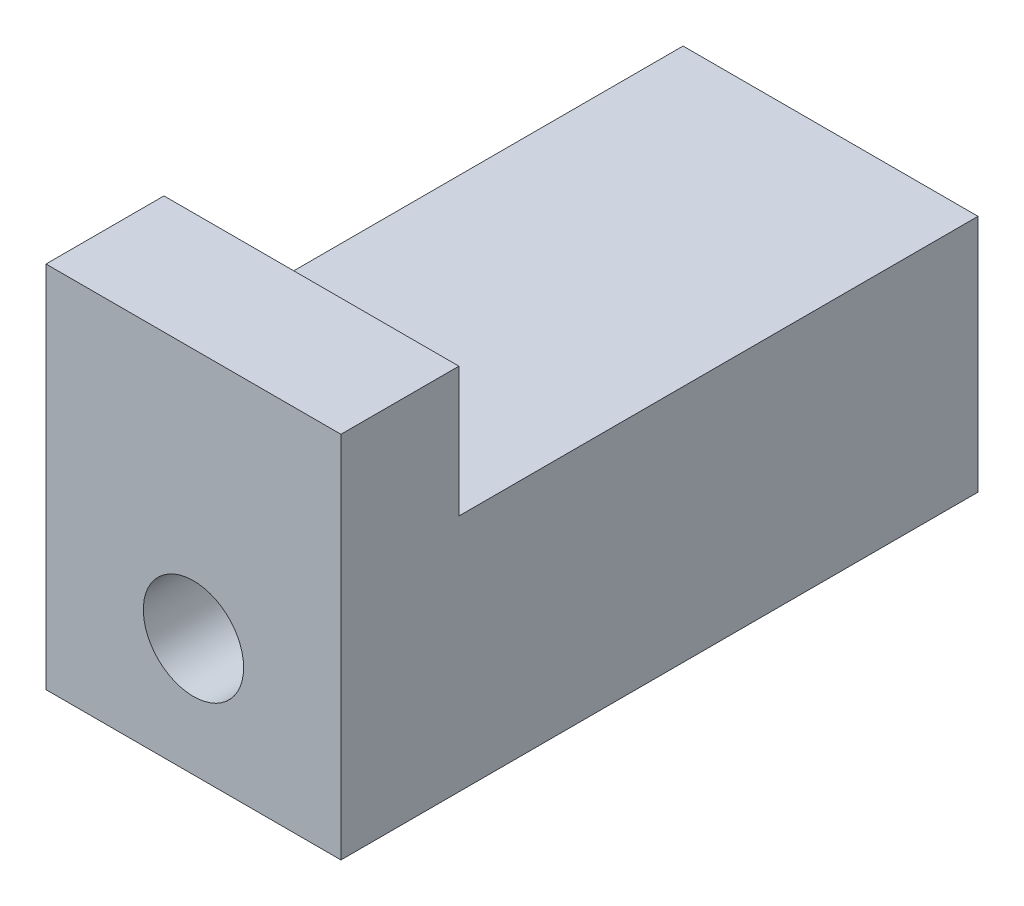
ISO-10303-21;
HEADER;
FILE_DESCRIPTION(('STEP AP214'),'2;1');
FILE_NAME('part.step','',(''),(''),'','','');
FILE_SCHEMA(('AUTOMOTIVE_DESIGN { 1 0 10303 214 1 1 1 1 }'));
ENDSEC;
DATA;
#1=APPLICATION_CONTEXT('core data for automotive mechanical design processes');
#2=APPLICATION_PROTOCOL_DEFINITION('international standard','automotive_design',2000,#1);
#3=PRODUCT_CONTEXT('',#1,'mechanical');
#4=PRODUCT('Part','Part','',(#3));
#5=PRODUCT_RELATED_PRODUCT_CATEGORY('part','',(#4));
#6=PRODUCT_DEFINITION_FORMATION('','',#4);
#7=PRODUCT_DEFINITION_CONTEXT('part definition',#1,'design');
#8=PRODUCT_DEFINITION('design','',#6,#7);
#9=PRODUCT_DEFINITION_SHAPE('','',#8);
#10=(LENGTH_UNIT() NAMED_UNIT(*) SI_UNIT(.MILLI.,.METRE.));
#11=(NAMED_UNIT(*) PLANE_ANGLE_UNIT() SI_UNIT($,.RADIAN.));
#12=(NAMED_UNIT(*) SI_UNIT($,.STERADIAN.) SOLID_ANGLE_UNIT());
#13=UNCERTAINTY_MEASURE_WITH_UNIT(LENGTH_MEASURE(1.E-05),#10,'distance_accuracy_value','');
#14=(GEOMETRIC_REPRESENTATION_CONTEXT(3) GLOBAL_UNCERTAINTY_ASSIGNED_CONTEXT((#13)) GLOBAL_UNIT_ASSIGNED_CONTEXT((#10,
#11,#12)) REPRESENTATION_CONTEXT('',''));
#15=CARTESIAN_POINT('',(0.,0.,0.));
#16=DIRECTION('',(0.,0.,1.));
#17=DIRECTION('',(1.,0.,0.));
#18=AXIS2_PLACEMENT_3D('',#15,#16,#17);
#19=CARTESIAN_POINT('',(128.,-48.5,221.8));
#20=DIRECTION('',(0.,0.,1.));
#21=DIRECTION('',(1.,0.,0.));
#22=AXIS2_PLACEMENT_3D('',#19,#20,#21);
#23=CYLINDRICAL_SURFACE('',#22,1.7);
#24=DIRECTION('',(0.,0.,1.));
#25=VECTOR('',#24,1.);
#26=CARTESIAN_POINT('',(129.7,-48.5,221.8));
#27=LINE('',#26,#25);
#28=CARTESIAN_POINT('',(129.7,-48.5,222.1));
#29=VERTEX_POINT('',#28);
#30=CARTESIAN_POINT('',(129.7,-48.5,243.7));
#31=VERTEX_POINT('',#30);
#32=EDGE_CURVE('E9',#29,#31,#27,.T.);
#33=ORIENTED_EDGE('',*,*,#32,.F.);
#34=CARTESIAN_POINT('',(128.,-48.5,222.1));
#35=DIRECTION('',(0.,0.,1.));
#36=DIRECTION('',(1.,0.,0.));
#37=AXIS2_PLACEMENT_3D('',#34,#35,#36);
#38=CIRCLE('',#37,1.7);
#39=EDGE_CURVE('E155',#29,#29,#38,.T.);
#40=ORIENTED_EDGE('',*,*,#39,.F.);
#41=ORIENTED_EDGE('',*,*,#32,.T.);
#42=CARTESIAN_POINT('',(128.,-48.5,243.7));
#43=DIRECTION('',(0.,0.,1.));
#44=DIRECTION('',(1.,0.,0.));
#45=AXIS2_PLACEMENT_3D('',#42,#43,#44);
#46=CIRCLE('',#45,1.7);
#47=EDGE_CURVE('E24',#31,#31,#46,.T.);
#48=ORIENTED_EDGE('',*,*,#47,.T.);
#49=EDGE_LOOP('',(#33,#40,#41,#48));
#50=FACE_BOUND('',#49,.T.);
#51=ADVANCED_FACE('F14',(#50),#23,.F.);
#52=CARTESIAN_POINT('',(133.,-52.5,222.1));
#53=DIRECTION('',(1.,0.,0.));
#54=DIRECTION('',(0.,1.,0.));
#55=AXIS2_PLACEMENT_3D('',#52,#53,#54);
#56=PLANE('',#55);
#57=DIRECTION('',(0.,0.,1.));
#58=VECTOR('',#57,1.);
#59=CARTESIAN_POINT('',(133.,-52.5,222.1));
#60=LINE('',#59,#58);
#61=CARTESIAN_POINT('',(133.,-52.5,222.1));
#62=VERTEX_POINT('',#61);
#63=CARTESIAN_POINT('',(133.,-52.5,243.7));
#64=VERTEX_POINT('',#63);
#65=EDGE_CURVE('E141',#62,#64,#60,.T.);
#66=ORIENTED_EDGE('',*,*,#65,.F.);
#67=DIRECTION('',(0.,1.,0.));
#68=VECTOR('',#67,1.);
#69=CARTESIAN_POINT('',(133.,-52.5,222.1));
#70=LINE('',#69,#68);
#71=CARTESIAN_POINT('',(133.,-44.4,222.1));
#72=VERTEX_POINT('',#71);
#73=EDGE_CURVE('E136',#62,#72,#70,.T.);
#74=ORIENTED_EDGE('',*,*,#73,.T.);
#75=DIRECTION('',(0.,0.,1.));
#76=VECTOR('',#75,1.);
#77=CARTESIAN_POINT('',(133.,-44.4,222.1));
#78=LINE('',#77,#76);
#79=CARTESIAN_POINT('',(133.,-44.4,239.7));
#80=VERTEX_POINT('',#79);
#81=EDGE_CURVE('E71',#72,#80,#78,.T.);
#82=ORIENTED_EDGE('',*,*,#81,.T.);
#83=DIRECTION('',(0.,1.,0.));
#84=VECTOR('',#83,1.);
#85=CARTESIAN_POINT('',(133.,-52.5,239.7));
#86=LINE('',#85,#84);
#87=CARTESIAN_POINT('',(133.,-40.,239.7));
#88=VERTEX_POINT('',#87);
#89=EDGE_CURVE('E111',#80,#88,#86,.T.);
#90=ORIENTED_EDGE('',*,*,#89,.T.);
#91=DIRECTION('',(0.,0.,1.));
#92=VECTOR('',#91,1.);
#93=CARTESIAN_POINT('',(133.,-40.,239.7));
#94=LINE('',#93,#92);
#95=CARTESIAN_POINT('',(133.,-40.,243.7));
#96=VERTEX_POINT('',#95);
#97=EDGE_CURVE('E107',#88,#96,#94,.T.);
#98=ORIENTED_EDGE('',*,*,#97,.T.);
#99=DIRECTION('',(0.,1.,0.));
#100=VECTOR('',#99,1.);
#101=CARTESIAN_POINT('',(133.,-52.5,243.7));
#102=LINE('',#101,#100);
#103=EDGE_CURVE('E18',#64,#96,#102,.T.);
#104=ORIENTED_EDGE('',*,*,#103,.F.);
#105=EDGE_LOOP('',(#66,#74,#82,#90,#98,#104));
#106=FACE_BOUND('',#105,.T.);
#107=ADVANCED_FACE('F185',(#106),#56,.T.);
#108=CARTESIAN_POINT('',(123.,-52.5,243.7));
#109=DIRECTION('',(0.,0.,1.));
#110=DIRECTION('',(1.,0.,0.));
#111=AXIS2_PLACEMENT_3D('',#108,#109,#110);
#112=PLANE('',#111);
#113=ORIENTED_EDGE('',*,*,#47,.F.);
#114=EDGE_LOOP('',(#113));
#115=FACE_BOUND('',#114,.T.);
#116=DIRECTION('',(0.,1.,0.));
#117=VECTOR('',#116,1.);
#118=CARTESIAN_POINT('',(123.,-52.5,243.7));
#119=LINE('',#118,#117);
#120=CARTESIAN_POINT('',(123.,-52.5,243.7));
#121=VERTEX_POINT('',#120);
#122=CARTESIAN_POINT('',(123.,-40.,243.7));
#123=VERTEX_POINT('',#122);
#124=EDGE_CURVE('E126',#121,#123,#119,.T.);
#125=ORIENTED_EDGE('',*,*,#124,.F.);
#126=DIRECTION('',(1.,0.,0.));
#127=VECTOR('',#126,1.);
#128=CARTESIAN_POINT('',(123.,-52.5,243.7));
#129=LINE('',#128,#127);
#130=EDGE_CURVE('E138',#121,#64,#129,.T.);
#131=ORIENTED_EDGE('',*,*,#130,.T.);
#132=ORIENTED_EDGE('',*,*,#103,.T.);
#133=DIRECTION('',(1.,0.,0.));
#134=VECTOR('',#133,1.);
#135=CARTESIAN_POINT('',(123.,-40.,243.7));
#136=LINE('',#135,#134);
#137=EDGE_CURVE('E150',#123,#96,#136,.T.);
#138=ORIENTED_EDGE('',*,*,#137,.F.);
#139=EDGE_LOOP('',(#125,#131,#132,#138));
#140=FACE_BOUND('',#139,.T.);
#141=ADVANCED_FACE('F196',(#115,#140),#112,.T.);
#142=CARTESIAN_POINT('',(123.,-40.,239.7));
#143=DIRECTION('',(0.,1.,0.));
#144=DIRECTION('',(1.,0.,0.));
#145=AXIS2_PLACEMENT_3D('',#142,#143,#144);
#146=PLANE('',#145);
#147=DIRECTION('',(1.,0.,0.));
#148=VECTOR('',#147,1.);
#149=CARTESIAN_POINT('',(123.,-40.,239.7));
#150=LINE('',#149,#148);
#151=CARTESIAN_POINT('',(123.,-40.,239.7));
#152=VERTEX_POINT('',#151);
#153=EDGE_CURVE('E100',#152,#88,#150,.T.);
#154=ORIENTED_EDGE('',*,*,#153,.F.);
#155=DIRECTION('',(0.,0.,1.));
#156=VECTOR('',#155,1.);
#157=CARTESIAN_POINT('',(123.,-40.,239.7));
#158=LINE('',#157,#156);
#159=EDGE_CURVE('E105',#152,#123,#158,.T.);
#160=ORIENTED_EDGE('',*,*,#159,.T.);
#161=ORIENTED_EDGE('',*,*,#137,.T.);
#162=ORIENTED_EDGE('',*,*,#97,.F.);
#163=EDGE_LOOP('',(#154,#160,#161,#162));
#164=FACE_BOUND('',#163,.T.);
#165=ADVANCED_FACE('F102',(#164),#146,.T.);
#166=CARTESIAN_POINT('',(123.,-52.5,239.7));
#167=DIRECTION('',(0.,0.,1.));
#168=DIRECTION('',(1.,0.,0.));
#169=AXIS2_PLACEMENT_3D('',#166,#167,#168);
#170=PLANE('',#169);
#171=ORIENTED_EDGE('',*,*,#153,.T.);
#172=ORIENTED_EDGE('',*,*,#89,.F.);
#173=DIRECTION('',(1.,0.,0.));
#174=VECTOR('',#173,1.);
#175=CARTESIAN_POINT('',(123.,-44.4,239.7));
#176=LINE('',#175,#174);
#177=CARTESIAN_POINT('',(123.,-44.4,239.7));
#178=VERTEX_POINT('',#177);
#179=EDGE_CURVE('E116',#178,#80,#176,.T.);
#180=ORIENTED_EDGE('',*,*,#179,.F.);
#181=DIRECTION('',(0.,1.,0.));
#182=VECTOR('',#181,1.);
#183=CARTESIAN_POINT('',(123.,-52.5,239.7));
#184=LINE('',#183,#182);
#185=EDGE_CURVE('E114',#178,#152,#184,.T.);
#186=ORIENTED_EDGE('',*,*,#185,.T.);
#187=EDGE_LOOP('',(#171,#172,#180,#186));
#188=FACE_BOUND('',#187,.T.);
#189=ADVANCED_FACE('F115',(#188),#170,.F.);
#190=CARTESIAN_POINT('',(123.,-44.4,222.1));
#191=DIRECTION('',(0.,1.,0.));
#192=DIRECTION('',(1.,0.,0.));
#193=AXIS2_PLACEMENT_3D('',#190,#191,#192);
#194=PLANE('',#193);
#195=DIRECTION('',(1.,0.,0.));
#196=VECTOR('',#195,1.);
#197=CARTESIAN_POINT('',(123.,-44.4,222.1));
#198=LINE('',#197,#196);
#199=CARTESIAN_POINT('',(123.,-44.4,222.1));
#200=VERTEX_POINT('',#199);
#201=EDGE_CURVE('E161',#200,#72,#198,.T.);
#202=ORIENTED_EDGE('',*,*,#201,.F.);
#203=DIRECTION('',(0.,0.,1.));
#204=VECTOR('',#203,1.);
#205=CARTESIAN_POINT('',(123.,-44.4,222.1));
#206=LINE('',#205,#204);
#207=EDGE_CURVE('E121',#200,#178,#206,.T.);
#208=ORIENTED_EDGE('',*,*,#207,.T.);
#209=ORIENTED_EDGE('',*,*,#179,.T.);
#210=ORIENTED_EDGE('',*,*,#81,.F.);
#211=EDGE_LOOP('',(#202,#208,#209,#210));
#212=FACE_BOUND('',#211,.T.);
#213=ADVANCED_FACE('F186',(#212),#194,.T.);
#214=CARTESIAN_POINT('',(123.,-52.5,222.1));
#215=DIRECTION('',(0.,0.,1.));
#216=DIRECTION('',(1.,0.,0.));
#217=AXIS2_PLACEMENT_3D('',#214,#215,#216);
#218=PLANE('',#217);
#219=ORIENTED_EDGE('',*,*,#39,.T.);
#220=EDGE_LOOP('',(#219));
#221=FACE_BOUND('',#220,.T.);
#222=ORIENTED_EDGE('',*,*,#201,.T.);
#223=ORIENTED_EDGE('',*,*,#73,.F.);
#224=DIRECTION('',(1.,0.,0.));
#225=VECTOR('',#224,1.);
#226=CARTESIAN_POINT('',(123.,-52.5,222.1));
#227=LINE('',#226,#225);
#228=CARTESIAN_POINT('',(123.,-52.5,222.1));
#229=VERTEX_POINT('',#228);
#230=EDGE_CURVE('E140',#229,#62,#227,.T.);
#231=ORIENTED_EDGE('',*,*,#230,.F.);
#232=DIRECTION('',(0.,1.,0.));
#233=VECTOR('',#232,1.);
#234=CARTESIAN_POINT('',(123.,-52.5,222.1));
#235=LINE('',#234,#233);
#236=EDGE_CURVE('E146',#229,#200,#235,.T.);
#237=ORIENTED_EDGE('',*,*,#236,.T.);
#238=EDGE_LOOP('',(#222,#223,#231,#237));
#239=FACE_BOUND('',#238,.T.);
#240=ADVANCED_FACE('F16',(#221,#239),#218,.F.);
#241=CARTESIAN_POINT('',(123.,-52.5,222.1));
#242=DIRECTION('',(0.,1.,0.));
#243=DIRECTION('',(1.,0.,0.));
#244=AXIS2_PLACEMENT_3D('',#241,#242,#243);
#245=PLANE('',#244);
#246=ORIENTED_EDGE('',*,*,#65,.T.);
#247=ORIENTED_EDGE('',*,*,#130,.F.);
#248=DIRECTION('',(0.,0.,1.));
#249=VECTOR('',#248,1.);
#250=CARTESIAN_POINT('',(123.,-52.5,222.1));
#251=LINE('',#250,#249);
#252=EDGE_CURVE('E145',#229,#121,#251,.T.);
#253=ORIENTED_EDGE('',*,*,#252,.F.);
#254=ORIENTED_EDGE('',*,*,#230,.T.);
#255=EDGE_LOOP('',(#246,#247,#253,#254));
#256=FACE_BOUND('',#255,.T.);
#257=ADVANCED_FACE('F181',(#256),#245,.F.);
#258=CARTESIAN_POINT('',(123.,-52.5,222.1));
#259=DIRECTION('',(1.,0.,0.));
#260=DIRECTION('',(0.,1.,0.));
#261=AXIS2_PLACEMENT_3D('',#258,#259,#260);
#262=PLANE('',#261);
#263=ORIENTED_EDGE('',*,*,#124,.T.);
#264=ORIENTED_EDGE('',*,*,#159,.F.);
#265=ORIENTED_EDGE('',*,*,#185,.F.);
#266=ORIENTED_EDGE('',*,*,#207,.F.);
#267=ORIENTED_EDGE('',*,*,#236,.F.);
#268=ORIENTED_EDGE('',*,*,#252,.T.);
#269=EDGE_LOOP('',(#263,#264,#265,#266,#267,#268));
#270=FACE_BOUND('',#269,.T.);
#271=ADVANCED_FACE('F123',(#270),#262,.F.);
#272=CLOSED_SHELL('',(#51,#107,#141,#165,#189,#213,#240,#257,#271));
#273=MANIFOLD_SOLID_BREP('B1',#272);
#274=ADVANCED_BREP_SHAPE_REPRESENTATION('',(#18,#273),#14);
#275=SHAPE_DEFINITION_REPRESENTATION(#9,#274);
ENDSEC;
END-ISO-10303-21;
